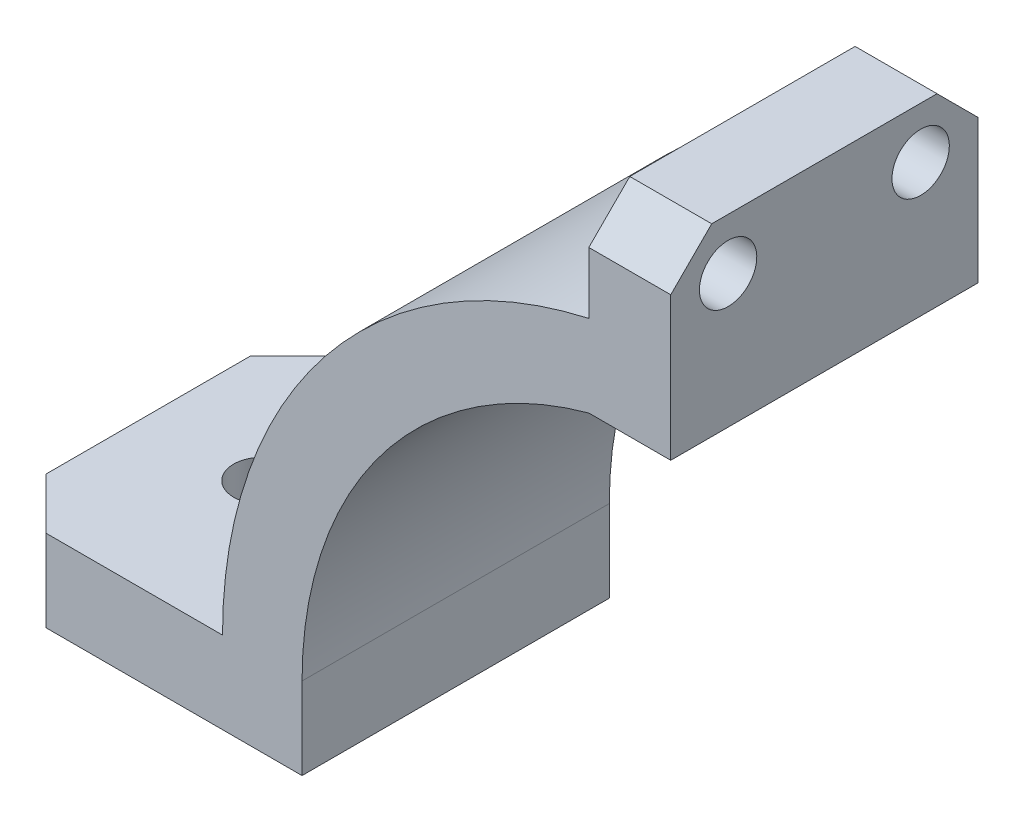
ISO-10303-21;
HEADER;
FILE_DESCRIPTION(('STEP AP214'),'2;1');
FILE_NAME('part.step','',(''),(''),'','','');
FILE_SCHEMA(('AUTOMOTIVE_DESIGN { 1 0 10303 214 1 1 1 1 }'));
ENDSEC;
DATA;
#1=APPLICATION_CONTEXT('core data for automotive mechanical design processes');
#2=APPLICATION_PROTOCOL_DEFINITION('international standard','automotive_design',2000,#1);
#3=PRODUCT_CONTEXT('',#1,'mechanical');
#4=PRODUCT('Part','Part','',(#3));
#5=PRODUCT_RELATED_PRODUCT_CATEGORY('part','',(#4));
#6=PRODUCT_DEFINITION_FORMATION('','',#4);
#7=PRODUCT_DEFINITION_CONTEXT('part definition',#1,'design');
#8=PRODUCT_DEFINITION('design','',#6,#7);
#9=PRODUCT_DEFINITION_SHAPE('','',#8);
#10=(LENGTH_UNIT() NAMED_UNIT(*) SI_UNIT(.MILLI.,.METRE.));
#11=(NAMED_UNIT(*) PLANE_ANGLE_UNIT() SI_UNIT($,.RADIAN.));
#12=(NAMED_UNIT(*) SI_UNIT($,.STERADIAN.) SOLID_ANGLE_UNIT());
#13=UNCERTAINTY_MEASURE_WITH_UNIT(LENGTH_MEASURE(1.E-05),#10,'distance_accuracy_value','');
#14=(GEOMETRIC_REPRESENTATION_CONTEXT(3) GLOBAL_UNCERTAINTY_ASSIGNED_CONTEXT((#13)) GLOBAL_UNIT_ASSIGNED_CONTEXT((#10,
#11,#12)) REPRESENTATION_CONTEXT('',''));
#15=CARTESIAN_POINT('',(0.,0.,0.));
#16=DIRECTION('',(0.,0.,1.));
#17=DIRECTION('',(1.,0.,0.));
#18=AXIS2_PLACEMENT_3D('',#15,#16,#17);
#19=CARTESIAN_POINT('',(0.,0.,15.));
#20=DIRECTION('',(0.,0.,-1.));
#21=DIRECTION('',(-1.,0.,0.));
#22=AXIS2_PLACEMENT_3D('',#19,#20,#21);
#23=CYLINDRICAL_SURFACE('',#22,19.);
#24=CARTESIAN_POINT('',(0.,0.,0.));
#25=DIRECTION('',(0.,0.,-1.));
#26=DIRECTION('',(-1.,0.,0.));
#27=AXIS2_PLACEMENT_3D('',#24,#25,#26);
#28=CIRCLE('',#27,19.);
#29=CARTESIAN_POINT('',(-19.,0.,0.));
#30=VERTEX_POINT('',#29);
#31=CARTESIAN_POINT('',(-5.,18.3303027798234,0.));
#32=VERTEX_POINT('',#31);
#33=EDGE_CURVE('E169',#30,#32,#28,.T.);
#34=ORIENTED_EDGE('',*,*,#33,.T.);
#35=DIRECTION('',(0.,0.,-1.));
#36=VECTOR('',#35,1.);
#37=CARTESIAN_POINT('',(-5.,18.3303027798234,15.));
#38=LINE('',#37,#36);
#39=CARTESIAN_POINT('',(-5.,18.3303027798234,15.));
#40=VERTEX_POINT('',#39);
#41=EDGE_CURVE('E149',#40,#32,#38,.T.);
#42=ORIENTED_EDGE('',*,*,#41,.F.);
#43=CARTESIAN_POINT('',(0.,0.,15.));
#44=DIRECTION('',(0.,0.,-1.));
#45=DIRECTION('',(-1.,0.,0.));
#46=AXIS2_PLACEMENT_3D('',#43,#44,#45);
#47=CIRCLE('',#46,19.);
#48=CARTESIAN_POINT('',(-19.,0.,15.));
#49=VERTEX_POINT('',#48);
#50=EDGE_CURVE('E157',#49,#40,#47,.T.);
#51=ORIENTED_EDGE('',*,*,#50,.F.);
#52=DIRECTION('',(0.,0.,-1.));
#53=VECTOR('',#52,1.);
#54=CARTESIAN_POINT('',(-19.,0.,15.));
#55=LINE('',#54,#53);
#56=EDGE_CURVE('E240',#49,#30,#55,.T.);
#57=ORIENTED_EDGE('',*,*,#56,.T.);
#58=EDGE_LOOP('',(#34,#42,#51,#57));
#59=FACE_BOUND('',#58,.T.);
#60=ADVANCED_FACE('F42',(#59),#23,.F.);
#61=CARTESIAN_POINT('',(-0.999999999999999,18.3303027798234,15.));
#62=DIRECTION('',(0.,1.,0.));
#63=DIRECTION('',(0.,0.,1.));
#64=AXIS2_PLACEMENT_3D('',#61,#62,#63);
#65=PLANE('',#64);
#66=DIRECTION('',(1.,0.,0.));
#67=VECTOR('',#66,1.);
#68=CARTESIAN_POINT('',(-0.999999999999999,18.3303027798234,0.));
#69=LINE('',#68,#67);
#70=CARTESIAN_POINT('',(-0.999999999999999,18.3303027798234,0.));
#71=VERTEX_POINT('',#70);
#72=EDGE_CURVE('E254',#32,#71,#69,.T.);
#73=ORIENTED_EDGE('',*,*,#72,.T.);
#74=DIRECTION('',(0.,0.,-1.));
#75=VECTOR('',#74,1.);
#76=CARTESIAN_POINT('',(-0.999999999999999,18.3303027798234,15.));
#77=LINE('',#76,#75);
#78=CARTESIAN_POINT('',(-0.999999999999999,18.3303027798234,15.));
#79=VERTEX_POINT('',#78);
#80=EDGE_CURVE('E152',#79,#71,#77,.T.);
#81=ORIENTED_EDGE('',*,*,#80,.F.);
#82=DIRECTION('',(1.,0.,0.));
#83=VECTOR('',#82,1.);
#84=CARTESIAN_POINT('',(-0.999999999999999,18.3303027798234,15.));
#85=LINE('',#84,#83);
#86=EDGE_CURVE('E145',#40,#79,#85,.T.);
#87=ORIENTED_EDGE('',*,*,#86,.F.);
#88=ORIENTED_EDGE('',*,*,#41,.T.);
#89=EDGE_LOOP('',(#73,#81,#87,#88));
#90=FACE_BOUND('',#89,.T.);
#91=ADVANCED_FACE('F147',(#90),#65,.F.);
#92=CARTESIAN_POINT('',(-1.,27.3303027798234,15.));
#93=DIRECTION('',(-1.,0.,0.));
#94=DIRECTION('',(0.,-1.,0.));
#95=AXIS2_PLACEMENT_3D('',#92,#93,#94);
#96=PLANE('',#95);
#97=CARTESIAN_POINT('',(-0.999999999999999,24.8303027798234,2.8));
#98=DIRECTION('',(-1.,0.,0.));
#99=DIRECTION('',(0.,-1.,0.));
#100=AXIS2_PLACEMENT_3D('',#97,#98,#99);
#101=CIRCLE('',#100,1.4);
#102=CARTESIAN_POINT('',(-0.999999999999999,23.4303027798234,2.8));
#103=VERTEX_POINT('',#102);
#104=EDGE_CURVE('E257',#103,#103,#101,.T.);
#105=ORIENTED_EDGE('',*,*,#104,.T.);
#106=EDGE_LOOP('',(#105));
#107=FACE_BOUND('',#106,.T.);
#108=CARTESIAN_POINT('',(-0.999999999999999,24.8303027798234,12.2));
#109=DIRECTION('',(-1.,0.,0.));
#110=DIRECTION('',(0.,-1.,0.));
#111=AXIS2_PLACEMENT_3D('',#108,#109,#110);
#112=CIRCLE('',#111,1.4);
#113=CARTESIAN_POINT('',(-0.999999999999999,23.4303027798234,12.2));
#114=VERTEX_POINT('',#113);
#115=EDGE_CURVE('E269',#114,#114,#112,.T.);
#116=ORIENTED_EDGE('',*,*,#115,.T.);
#117=EDGE_LOOP('',(#116));
#118=FACE_BOUND('',#117,.T.);
#119=DIRECTION('',(0.,0.,-1.));
#120=VECTOR('',#119,1.);
#121=CARTESIAN_POINT('',(-1.,27.3303027798234,15.));
#122=LINE('',#121,#120);
#123=CARTESIAN_POINT('',(-1.,27.3303027798234,13.));
#124=VERTEX_POINT('',#123);
#125=CARTESIAN_POINT('',(-1.,27.3303027798234,2.));
#126=VERTEX_POINT('',#125);
#127=EDGE_CURVE('E174',#124,#126,#122,.T.);
#128=ORIENTED_EDGE('',*,*,#127,.F.);
#129=DIRECTION('',(0.,0.707106781186546,-0.707106781186549));
#130=VECTOR('',#129,1.);
#131=CARTESIAN_POINT('',(-1.,25.3303027798234,15.));
#132=LINE('',#131,#130);
#133=CARTESIAN_POINT('',(-1.,25.3303027798234,15.));
#134=VERTEX_POINT('',#133);
#135=EDGE_CURVE('E51',#124,#134,#132,.F.);
#136=ORIENTED_EDGE('',*,*,#135,.T.);
#137=DIRECTION('',(0.,1.,0.));
#138=VECTOR('',#137,1.);
#139=CARTESIAN_POINT('',(-1.,27.3303027798234,15.));
#140=LINE('',#139,#138);
#141=EDGE_CURVE('E156',#79,#134,#140,.T.);
#142=ORIENTED_EDGE('',*,*,#141,.F.);
#143=ORIENTED_EDGE('',*,*,#80,.T.);
#144=DIRECTION('',(0.,1.,0.));
#145=VECTOR('',#144,1.);
#146=CARTESIAN_POINT('',(-1.,27.3303027798234,0.));
#147=LINE('',#146,#145);
#148=CARTESIAN_POINT('',(-1.,25.3303027798234,0.));
#149=VERTEX_POINT('',#148);
#150=EDGE_CURVE('E252',#71,#149,#147,.T.);
#151=ORIENTED_EDGE('',*,*,#150,.T.);
#152=DIRECTION('',(0.,0.707106781186549,0.707106781186546));
#153=VECTOR('',#152,1.);
#154=CARTESIAN_POINT('',(-1.,27.3303027798234,2.));
#155=LINE('',#154,#153);
#156=EDGE_CURVE('E63',#149,#126,#155,.T.);
#157=ORIENTED_EDGE('',*,*,#156,.T.);
#158=EDGE_LOOP('',(#128,#136,#142,#143,#151,#157));
#159=FACE_BOUND('',#158,.T.);
#160=ADVANCED_FACE('F206',(#107,#118,#159),#96,.F.);
#161=CARTESIAN_POINT('',(-5.,27.3303027798234,15.));
#162=DIRECTION('',(0.,-1.,0.));
#163=DIRECTION('',(0.,0.,-1.));
#164=AXIS2_PLACEMENT_3D('',#161,#162,#163);
#165=PLANE('',#164);
#166=DIRECTION('',(0.,0.,-1.));
#167=VECTOR('',#166,1.);
#168=CARTESIAN_POINT('',(-5.,27.3303027798234,15.));
#169=LINE('',#168,#167);
#170=CARTESIAN_POINT('',(-5.,27.3303027798234,13.));
#171=VERTEX_POINT('',#170);
#172=CARTESIAN_POINT('',(-5.,27.3303027798234,2.));
#173=VERTEX_POINT('',#172);
#174=EDGE_CURVE('E218',#171,#173,#169,.T.);
#175=ORIENTED_EDGE('',*,*,#174,.F.);
#176=DIRECTION('',(1.,0.,0.));
#177=VECTOR('',#176,1.);
#178=CARTESIAN_POINT('',(-5.,27.3303027798234,13.));
#179=LINE('',#178,#177);
#180=EDGE_CURVE('E203',#171,#124,#179,.T.);
#181=ORIENTED_EDGE('',*,*,#180,.T.);
#182=ORIENTED_EDGE('',*,*,#127,.T.);
#183=DIRECTION('',(-1.,0.,0.));
#184=VECTOR('',#183,1.);
#185=CARTESIAN_POINT('',(-5.,27.3303027798234,2.));
#186=LINE('',#185,#184);
#187=EDGE_CURVE('E200',#126,#173,#186,.T.);
#188=ORIENTED_EDGE('',*,*,#187,.T.);
#189=EDGE_LOOP('',(#175,#181,#182,#188));
#190=FACE_BOUND('',#189,.T.);
#191=ADVANCED_FACE('F221',(#190),#165,.F.);
#192=CARTESIAN_POINT('',(-5.,22.3303027798234,15.));
#193=DIRECTION('',(1.,0.,0.));
#194=DIRECTION('',(0.,1.,0.));
#195=AXIS2_PLACEMENT_3D('',#192,#193,#194);
#196=PLANE('',#195);
#197=CARTESIAN_POINT('',(-5.,24.8303027798234,2.8));
#198=DIRECTION('',(-1.,0.,0.));
#199=DIRECTION('',(0.,-1.,0.));
#200=AXIS2_PLACEMENT_3D('',#197,#198,#199);
#201=CIRCLE('',#200,1.4);
#202=CARTESIAN_POINT('',(-5.,23.4303027798234,2.8));
#203=VERTEX_POINT('',#202);
#204=EDGE_CURVE('E272',#203,#203,#201,.T.);
#205=ORIENTED_EDGE('',*,*,#204,.F.);
#206=EDGE_LOOP('',(#205));
#207=FACE_BOUND('',#206,.T.);
#208=CARTESIAN_POINT('',(-5.,24.8303027798234,12.2));
#209=DIRECTION('',(-1.,0.,0.));
#210=DIRECTION('',(0.,-1.,0.));
#211=AXIS2_PLACEMENT_3D('',#208,#209,#210);
#212=CIRCLE('',#211,1.4);
#213=CARTESIAN_POINT('',(-5.,23.4303027798234,12.2));
#214=VERTEX_POINT('',#213);
#215=EDGE_CURVE('E273',#214,#214,#212,.T.);
#216=ORIENTED_EDGE('',*,*,#215,.F.);
#217=EDGE_LOOP('',(#216));
#218=FACE_BOUND('',#217,.T.);
#219=DIRECTION('',(0.,-1.,0.));
#220=VECTOR('',#219,1.);
#221=CARTESIAN_POINT('',(-5.,22.3303027798234,15.));
#222=LINE('',#221,#220);
#223=CARTESIAN_POINT('',(-5.,25.3303027798234,15.));
#224=VERTEX_POINT('',#223);
#225=CARTESIAN_POINT('',(-5.,22.3303027798234,15.));
#226=VERTEX_POINT('',#225);
#227=EDGE_CURVE('E211',#224,#226,#222,.T.);
#228=ORIENTED_EDGE('',*,*,#227,.F.);
#229=DIRECTION('',(0.,-0.707106781186546,0.707106781186549));
#230=VECTOR('',#229,1.);
#231=CARTESIAN_POINT('',(-5.,25.3303027798234,15.));
#232=LINE('',#231,#230);
#233=EDGE_CURVE('E198',#224,#171,#232,.F.);
#234=ORIENTED_EDGE('',*,*,#233,.T.);
#235=ORIENTED_EDGE('',*,*,#174,.T.);
#236=DIRECTION('',(0.,-0.707106781186549,-0.707106781186546));
#237=VECTOR('',#236,1.);
#238=CARTESIAN_POINT('',(-5.,27.3303027798234,2.));
#239=LINE('',#238,#237);
#240=CARTESIAN_POINT('',(-5.,25.3303027798234,0.));
#241=VERTEX_POINT('',#240);
#242=EDGE_CURVE('E196',#173,#241,#239,.T.);
#243=ORIENTED_EDGE('',*,*,#242,.T.);
#244=DIRECTION('',(0.,-1.,0.));
#245=VECTOR('',#244,1.);
#246=CARTESIAN_POINT('',(-5.,22.3303027798234,0.));
#247=LINE('',#246,#245);
#248=CARTESIAN_POINT('',(-5.,22.3303027798234,0.));
#249=VERTEX_POINT('',#248);
#250=EDGE_CURVE('E250',#241,#249,#247,.T.);
#251=ORIENTED_EDGE('',*,*,#250,.T.);
#252=DIRECTION('',(0.,0.,-1.));
#253=VECTOR('',#252,1.);
#254=CARTESIAN_POINT('',(-5.,22.3303027798234,15.));
#255=LINE('',#254,#253);
#256=EDGE_CURVE('E223',#226,#249,#255,.T.);
#257=ORIENTED_EDGE('',*,*,#256,.F.);
#258=EDGE_LOOP('',(#228,#234,#235,#243,#251,#257));
#259=FACE_BOUND('',#258,.T.);
#260=ADVANCED_FACE('F217',(#207,#218,#259),#196,.F.);
#261=CARTESIAN_POINT('',(0.,0.,15.));
#262=DIRECTION('',(0.,0.,-1.));
#263=DIRECTION('',(-1.,0.,0.));
#264=AXIS2_PLACEMENT_3D('',#261,#262,#263);
#265=CYLINDRICAL_SURFACE('',#264,22.8832345230867);
#266=CARTESIAN_POINT('',(0.,0.,0.));
#267=DIRECTION('',(0.,0.,1.));
#268=DIRECTION('',(-1.,0.,0.));
#269=AXIS2_PLACEMENT_3D('',#266,#267,#268);
#270=CIRCLE('',#269,22.8832345230867);
#271=CARTESIAN_POINT('',(-22.8832345230867,0.,0.));
#272=VERTEX_POINT('',#271);
#273=EDGE_CURVE('E248',#249,#272,#270,.T.);
#274=ORIENTED_EDGE('',*,*,#273,.T.);
#275=DIRECTION('',(0.,0.,-1.));
#276=VECTOR('',#275,1.);
#277=CARTESIAN_POINT('',(-22.8832345230867,0.,15.));
#278=LINE('',#277,#276);
#279=CARTESIAN_POINT('',(-22.8832345230867,0.,15.));
#280=VERTEX_POINT('',#279);
#281=EDGE_CURVE('E226',#280,#272,#278,.T.);
#282=ORIENTED_EDGE('',*,*,#281,.F.);
#283=CARTESIAN_POINT('',(0.,0.,15.));
#284=DIRECTION('',(0.,0.,1.));
#285=DIRECTION('',(-1.,0.,0.));
#286=AXIS2_PLACEMENT_3D('',#283,#284,#285);
#287=CIRCLE('',#286,22.8832345230867);
#288=EDGE_CURVE('E264',#226,#280,#287,.T.);
#289=ORIENTED_EDGE('',*,*,#288,.F.);
#290=ORIENTED_EDGE('',*,*,#256,.T.);
#291=EDGE_LOOP('',(#274,#282,#289,#290));
#292=FACE_BOUND('',#291,.T.);
#293=ADVANCED_FACE('F298',(#292),#265,.T.);
#294=CARTESIAN_POINT('',(-34.,0.,15.));
#295=DIRECTION('',(0.,-1.,0.));
#296=DIRECTION('',(0.,0.,-1.));
#297=AXIS2_PLACEMENT_3D('',#294,#295,#296);
#298=PLANE('',#297);
#299=CARTESIAN_POINT('',(-28.4416172615434,0.,7.5));
#300=DIRECTION('',(0.,1.,0.));
#301=DIRECTION('',(0.,0.,1.));
#302=AXIS2_PLACEMENT_3D('',#299,#300,#301);
#303=CIRCLE('',#302,1.4);
#304=CARTESIAN_POINT('',(-28.4416172615434,0.,8.9));
#305=VERTEX_POINT('',#304);
#306=EDGE_CURVE('E279',#305,#305,#303,.T.);
#307=ORIENTED_EDGE('',*,*,#306,.F.);
#308=EDGE_LOOP('',(#307));
#309=FACE_BOUND('',#308,.T.);
#310=DIRECTION('',(-1.,0.,0.));
#311=VECTOR('',#310,1.);
#312=CARTESIAN_POINT('',(-34.,0.,0.));
#313=LINE('',#312,#311);
#314=CARTESIAN_POINT('',(-31.5,0.,0.));
#315=VERTEX_POINT('',#314);
#316=EDGE_CURVE('E245',#272,#315,#313,.T.);
#317=ORIENTED_EDGE('',*,*,#316,.T.);
#318=DIRECTION('',(-0.707106781186548,0.,0.707106781186548));
#319=VECTOR('',#318,1.);
#320=CARTESIAN_POINT('',(-34.,0.,2.50000000000001));
#321=LINE('',#320,#319);
#322=CARTESIAN_POINT('',(-34.,0.,2.50000000000001));
#323=VERTEX_POINT('',#322);
#324=EDGE_CURVE('E188',#315,#323,#321,.T.);
#325=ORIENTED_EDGE('',*,*,#324,.T.);
#326=DIRECTION('',(0.,0.,-1.));
#327=VECTOR('',#326,1.);
#328=CARTESIAN_POINT('',(-34.,0.,15.));
#329=LINE('',#328,#327);
#330=CARTESIAN_POINT('',(-34.,0.,12.5));
#331=VERTEX_POINT('',#330);
#332=EDGE_CURVE('E231',#331,#323,#329,.T.);
#333=ORIENTED_EDGE('',*,*,#332,.F.);
#334=DIRECTION('',(-0.707106781186549,0.,-0.707106781186547));
#335=VECTOR('',#334,1.);
#336=CARTESIAN_POINT('',(-31.5,0.,15.));
#337=LINE('',#336,#335);
#338=CARTESIAN_POINT('',(-31.5,0.,15.));
#339=VERTEX_POINT('',#338);
#340=EDGE_CURVE('E186',#331,#339,#337,.F.);
#341=ORIENTED_EDGE('',*,*,#340,.T.);
#342=DIRECTION('',(-1.,0.,0.));
#343=VECTOR('',#342,1.);
#344=CARTESIAN_POINT('',(-34.,0.,15.));
#345=LINE('',#344,#343);
#346=EDGE_CURVE('E261',#280,#339,#345,.T.);
#347=ORIENTED_EDGE('',*,*,#346,.F.);
#348=ORIENTED_EDGE('',*,*,#281,.T.);
#349=EDGE_LOOP('',(#317,#325,#333,#341,#347,#348));
#350=FACE_BOUND('',#349,.T.);
#351=ADVANCED_FACE('F294',(#309,#350),#298,.F.);
#352=CARTESIAN_POINT('',(-34.,-4.,15.));
#353=DIRECTION('',(1.,0.,0.));
#354=DIRECTION('',(0.,1.,0.));
#355=AXIS2_PLACEMENT_3D('',#352,#353,#354);
#356=PLANE('',#355);
#357=ORIENTED_EDGE('',*,*,#332,.T.);
#358=DIRECTION('',(0.,-1.,0.));
#359=VECTOR('',#358,1.);
#360=CARTESIAN_POINT('',(-34.,-4.,2.50000000000001));
#361=LINE('',#360,#359);
#362=CARTESIAN_POINT('',(-34.,-4.,2.50000000000001));
#363=VERTEX_POINT('',#362);
#364=EDGE_CURVE('E172',#323,#363,#361,.T.);
#365=ORIENTED_EDGE('',*,*,#364,.T.);
#366=DIRECTION('',(0.,0.,-1.));
#367=VECTOR('',#366,1.);
#368=CARTESIAN_POINT('',(-34.,-4.,15.));
#369=LINE('',#368,#367);
#370=CARTESIAN_POINT('',(-34.,-4.,12.5));
#371=VERTEX_POINT('',#370);
#372=EDGE_CURVE('E234',#371,#363,#369,.T.);
#373=ORIENTED_EDGE('',*,*,#372,.F.);
#374=DIRECTION('',(0.,1.,0.));
#375=VECTOR('',#374,1.);
#376=CARTESIAN_POINT('',(-34.,-4.,12.5));
#377=LINE('',#376,#375);
#378=EDGE_CURVE('E170',#371,#331,#377,.T.);
#379=ORIENTED_EDGE('',*,*,#378,.T.);
#380=EDGE_LOOP('',(#357,#365,#373,#379));
#381=FACE_BOUND('',#380,.T.);
#382=ADVANCED_FACE('F297',(#381),#356,.F.);
#383=CARTESIAN_POINT('',(-19.,-4.,15.));
#384=DIRECTION('',(0.,1.,0.));
#385=DIRECTION('',(-1.,0.,0.));
#386=AXIS2_PLACEMENT_3D('',#383,#384,#385);
#387=PLANE('',#386);
#388=CARTESIAN_POINT('',(-28.4416172615434,-4.,7.5));
#389=DIRECTION('',(0.,1.,0.));
#390=DIRECTION('',(0.,0.,1.));
#391=AXIS2_PLACEMENT_3D('',#388,#389,#390);
#392=CIRCLE('',#391,1.4);
#393=CARTESIAN_POINT('',(-28.4416172615434,-4.,8.9));
#394=VERTEX_POINT('',#393);
#395=EDGE_CURVE('E276',#394,#394,#392,.T.);
#396=ORIENTED_EDGE('',*,*,#395,.T.);
#397=EDGE_LOOP('',(#396));
#398=FACE_BOUND('',#397,.T.);
#399=ORIENTED_EDGE('',*,*,#372,.T.);
#400=DIRECTION('',(0.707106781186548,0.,-0.707106781186548));
#401=VECTOR('',#400,1.);
#402=CARTESIAN_POINT('',(-34.,-4.,2.50000000000001));
#403=LINE('',#402,#401);
#404=CARTESIAN_POINT('',(-31.5,-4.,0.));
#405=VERTEX_POINT('',#404);
#406=EDGE_CURVE('E182',#363,#405,#403,.T.);
#407=ORIENTED_EDGE('',*,*,#406,.T.);
#408=DIRECTION('',(1.,0.,0.));
#409=VECTOR('',#408,1.);
#410=CARTESIAN_POINT('',(-19.,-4.,0.));
#411=LINE('',#410,#409);
#412=CARTESIAN_POINT('',(-19.,-4.,0.));
#413=VERTEX_POINT('',#412);
#414=EDGE_CURVE('E243',#405,#413,#411,.T.);
#415=ORIENTED_EDGE('',*,*,#414,.T.);
#416=DIRECTION('',(0.,0.,-1.));
#417=VECTOR('',#416,1.);
#418=CARTESIAN_POINT('',(-19.,-4.,15.));
#419=LINE('',#418,#417);
#420=CARTESIAN_POINT('',(-19.,-4.,15.));
#421=VERTEX_POINT('',#420);
#422=EDGE_CURVE('E237',#421,#413,#419,.T.);
#423=ORIENTED_EDGE('',*,*,#422,.F.);
#424=DIRECTION('',(1.,0.,0.));
#425=VECTOR('',#424,1.);
#426=CARTESIAN_POINT('',(-19.,-4.,15.));
#427=LINE('',#426,#425);
#428=CARTESIAN_POINT('',(-31.5,-4.,15.));
#429=VERTEX_POINT('',#428);
#430=EDGE_CURVE('E259',#429,#421,#427,.T.);
#431=ORIENTED_EDGE('',*,*,#430,.F.);
#432=DIRECTION('',(0.707106781186549,0.,0.707106781186547));
#433=VECTOR('',#432,1.);
#434=CARTESIAN_POINT('',(-31.5,-4.,15.));
#435=LINE('',#434,#433);
#436=EDGE_CURVE('E180',#429,#371,#435,.F.);
#437=ORIENTED_EDGE('',*,*,#436,.T.);
#438=EDGE_LOOP('',(#399,#407,#415,#423,#431,#437));
#439=FACE_BOUND('',#438,.T.);
#440=ADVANCED_FACE('F285',(#398,#439),#387,.F.);
#441=CARTESIAN_POINT('',(-19.,0.,15.));
#442=DIRECTION('',(-1.,0.,0.));
#443=DIRECTION('',(0.,-1.,0.));
#444=AXIS2_PLACEMENT_3D('',#441,#442,#443);
#445=PLANE('',#444);
#446=DIRECTION('',(0.,1.,0.));
#447=VECTOR('',#446,1.);
#448=CARTESIAN_POINT('',(-19.,0.,0.));
#449=LINE('',#448,#447);
#450=EDGE_CURVE('E166',#413,#30,#449,.T.);
#451=ORIENTED_EDGE('',*,*,#450,.T.);
#452=ORIENTED_EDGE('',*,*,#56,.F.);
#453=DIRECTION('',(0.,1.,0.));
#454=VECTOR('',#453,1.);
#455=CARTESIAN_POINT('',(-19.,0.,15.));
#456=LINE('',#455,#454);
#457=EDGE_CURVE('E162',#421,#49,#456,.T.);
#458=ORIENTED_EDGE('',*,*,#457,.F.);
#459=ORIENTED_EDGE('',*,*,#422,.T.);
#460=EDGE_LOOP('',(#451,#452,#458,#459));
#461=FACE_BOUND('',#460,.T.);
#462=ADVANCED_FACE('F366',(#461),#445,.F.);
#463=CARTESIAN_POINT('',(0.,0.,15.));
#464=DIRECTION('',(0.,0.,-1.));
#465=DIRECTION('',(-1.,0.,0.));
#466=AXIS2_PLACEMENT_3D('',#463,#464,#465);
#467=PLANE('',#466);
#468=ORIENTED_EDGE('',*,*,#141,.T.);
#469=DIRECTION('',(-1.,0.,0.));
#470=VECTOR('',#469,1.);
#471=CARTESIAN_POINT('',(0.,25.3303027798234,15.));
#472=LINE('',#471,#470);
#473=EDGE_CURVE('E193',#134,#224,#472,.T.);
#474=ORIENTED_EDGE('',*,*,#473,.T.);
#475=ORIENTED_EDGE('',*,*,#227,.T.);
#476=ORIENTED_EDGE('',*,*,#288,.T.);
#477=ORIENTED_EDGE('',*,*,#346,.T.);
#478=DIRECTION('',(0.,-1.,0.));
#479=VECTOR('',#478,1.);
#480=CARTESIAN_POINT('',(-31.5,0.,15.));
#481=LINE('',#480,#479);
#482=EDGE_CURVE('E190',#339,#429,#481,.T.);
#483=ORIENTED_EDGE('',*,*,#482,.T.);
#484=ORIENTED_EDGE('',*,*,#430,.T.);
#485=ORIENTED_EDGE('',*,*,#457,.T.);
#486=ORIENTED_EDGE('',*,*,#50,.T.);
#487=ORIENTED_EDGE('',*,*,#86,.T.);
#488=EDGE_LOOP('',(#468,#474,#475,#476,#477,#483,#484,#485,#486,#487));
#489=FACE_BOUND('',#488,.T.);
#490=ADVANCED_FACE('F160',(#489),#467,.F.);
#491=CARTESIAN_POINT('',(0.,0.,0.));
#492=DIRECTION('',(0.,0.,-1.));
#493=DIRECTION('',(-1.,0.,0.));
#494=AXIS2_PLACEMENT_3D('',#491,#492,#493);
#495=PLANE('',#494);
#496=ORIENTED_EDGE('',*,*,#250,.F.);
#497=DIRECTION('',(1.,0.,0.));
#498=VECTOR('',#497,1.);
#499=CARTESIAN_POINT('',(-1.,25.3303027798234,0.));
#500=LINE('',#499,#498);
#501=EDGE_CURVE('E11',#241,#149,#500,.T.);
#502=ORIENTED_EDGE('',*,*,#501,.T.);
#503=ORIENTED_EDGE('',*,*,#150,.F.);
#504=ORIENTED_EDGE('',*,*,#72,.F.);
#505=ORIENTED_EDGE('',*,*,#33,.F.);
#506=ORIENTED_EDGE('',*,*,#450,.F.);
#507=ORIENTED_EDGE('',*,*,#414,.F.);
#508=DIRECTION('',(0.,1.,0.));
#509=VECTOR('',#508,1.);
#510=CARTESIAN_POINT('',(-31.5,0.,0.));
#511=LINE('',#510,#509);
#512=EDGE_CURVE('E184',#405,#315,#511,.T.);
#513=ORIENTED_EDGE('',*,*,#512,.T.);
#514=ORIENTED_EDGE('',*,*,#316,.F.);
#515=ORIENTED_EDGE('',*,*,#273,.F.);
#516=EDGE_LOOP('',(#496,#502,#503,#504,#505,#506,#507,#513,#514,#515));
#517=FACE_BOUND('',#516,.T.);
#518=ADVANCED_FACE('F322',(#517),#495,.T.);
#519=CARTESIAN_POINT('',(-34.,-4.,2.50000000000001));
#520=DIRECTION('',(-0.707106781186547,0.,-0.707106781186547));
#521=DIRECTION('',(0.,1.,0.));
#522=AXIS2_PLACEMENT_3D('',#519,#520,#521);
#523=PLANE('',#522);
#524=ORIENTED_EDGE('',*,*,#324,.F.);
#525=ORIENTED_EDGE('',*,*,#512,.F.);
#526=ORIENTED_EDGE('',*,*,#406,.F.);
#527=ORIENTED_EDGE('',*,*,#364,.F.);
#528=EDGE_LOOP('',(#524,#525,#526,#527));
#529=FACE_BOUND('',#528,.T.);
#530=ADVANCED_FACE('F309',(#529),#523,.T.);
#531=CARTESIAN_POINT('',(-31.5,0.,15.));
#532=DIRECTION('',(0.707106781186547,0.,-0.707106781186549));
#533=DIRECTION('',(0.,-1.,0.));
#534=AXIS2_PLACEMENT_3D('',#531,#532,#533);
#535=PLANE('',#534);
#536=ORIENTED_EDGE('',*,*,#340,.F.);
#537=ORIENTED_EDGE('',*,*,#378,.F.);
#538=ORIENTED_EDGE('',*,*,#436,.F.);
#539=ORIENTED_EDGE('',*,*,#482,.F.);
#540=EDGE_LOOP('',(#536,#537,#538,#539));
#541=FACE_BOUND('',#540,.T.);
#542=ADVANCED_FACE('F319',(#541),#535,.F.);
#543=CARTESIAN_POINT('',(10.,24.8303027798234,12.2));
#544=DIRECTION('',(-1.,0.,0.));
#545=DIRECTION('',(0.,-1.,0.));
#546=AXIS2_PLACEMENT_3D('',#543,#544,#545);
#547=CYLINDRICAL_SURFACE('',#546,1.4);
#548=ORIENTED_EDGE('',*,*,#215,.T.);
#549=EDGE_LOOP('',(#548));
#550=FACE_BOUND('',#549,.T.);
#551=ORIENTED_EDGE('',*,*,#115,.F.);
#552=EDGE_LOOP('',(#551));
#553=FACE_BOUND('',#552,.T.);
#554=ADVANCED_FACE('F347',(#550,#553),#547,.F.);
#555=CARTESIAN_POINT('',(10.,24.8303027798234,2.8));
#556=DIRECTION('',(-1.,0.,0.));
#557=DIRECTION('',(0.,-1.,0.));
#558=AXIS2_PLACEMENT_3D('',#555,#556,#557);
#559=CYLINDRICAL_SURFACE('',#558,1.4);
#560=ORIENTED_EDGE('',*,*,#204,.T.);
#561=EDGE_LOOP('',(#560));
#562=FACE_BOUND('',#561,.T.);
#563=ORIENTED_EDGE('',*,*,#104,.F.);
#564=EDGE_LOOP('',(#563));
#565=FACE_BOUND('',#564,.T.);
#566=ADVANCED_FACE('F328',(#562,#565),#559,.F.);
#567=CARTESIAN_POINT('',(0.,25.3303027798234,15.));
#568=DIRECTION('',(0.,-0.707106781186549,-0.707106781186546));
#569=DIRECTION('',(-1.,0.,0.));
#570=AXIS2_PLACEMENT_3D('',#567,#568,#569);
#571=PLANE('',#570);
#572=ORIENTED_EDGE('',*,*,#135,.F.);
#573=ORIENTED_EDGE('',*,*,#180,.F.);
#574=ORIENTED_EDGE('',*,*,#233,.F.);
#575=ORIENTED_EDGE('',*,*,#473,.F.);
#576=EDGE_LOOP('',(#572,#573,#574,#575));
#577=FACE_BOUND('',#576,.T.);
#578=ADVANCED_FACE('F213',(#577),#571,.F.);
#579=CARTESIAN_POINT('',(-5.,27.3303027798234,2.));
#580=DIRECTION('',(0.,0.707106781186546,-0.707106781186549));
#581=DIRECTION('',(1.,0.,0.));
#582=AXIS2_PLACEMENT_3D('',#579,#580,#581);
#583=PLANE('',#582);
#584=ORIENTED_EDGE('',*,*,#156,.F.);
#585=ORIENTED_EDGE('',*,*,#501,.F.);
#586=ORIENTED_EDGE('',*,*,#242,.F.);
#587=ORIENTED_EDGE('',*,*,#187,.F.);
#588=EDGE_LOOP('',(#584,#585,#586,#587));
#589=FACE_BOUND('',#588,.T.);
#590=ADVANCED_FACE('F45',(#589),#583,.T.);
#591=CARTESIAN_POINT('',(-28.4416172615434,-4.,7.5));
#592=DIRECTION('',(0.,1.,0.));
#593=DIRECTION('',(0.,0.,1.));
#594=AXIS2_PLACEMENT_3D('',#591,#592,#593);
#595=CYLINDRICAL_SURFACE('',#594,1.4);
#596=ORIENTED_EDGE('',*,*,#395,.F.);
#597=EDGE_LOOP('',(#596));
#598=FACE_BOUND('',#597,.T.);
#599=ORIENTED_EDGE('',*,*,#306,.T.);
#600=EDGE_LOOP('',(#599));
#601=FACE_BOUND('',#600,.T.);
#602=ADVANCED_FACE('F288',(#598,#601),#595,.F.);
#603=CLOSED_SHELL('',(#60,#91,#160,#191,#260,#293,#351,#382,#440,#462,#490,#518,#530,#542,#554,
#566,#578,#590,#602));
#604=MANIFOLD_SOLID_BREP('B2',#603);
#605=ADVANCED_BREP_SHAPE_REPRESENTATION('',(#18,#604),#14);
#606=SHAPE_DEFINITION_REPRESENTATION(#9,#605);
ENDSEC;
END-ISO-10303-21;
